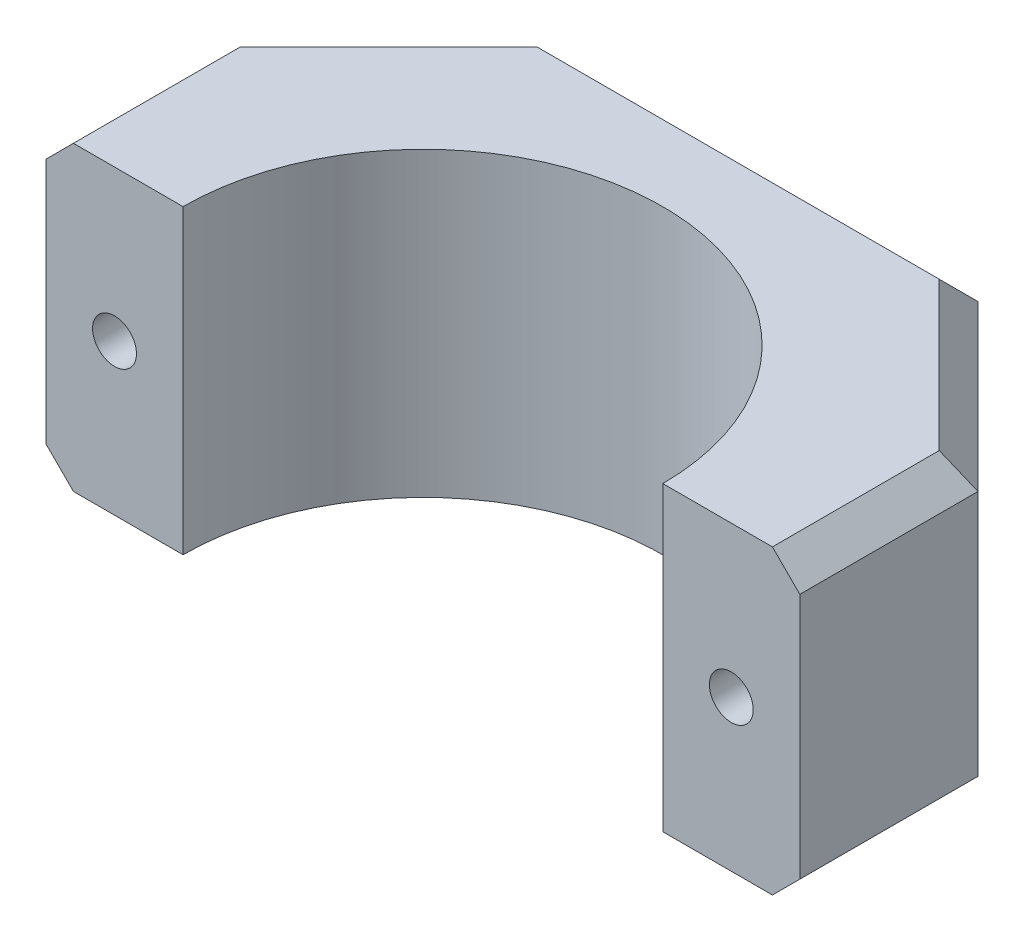
ISO-10303-21;
HEADER;
FILE_DESCRIPTION(('STEP AP214'),'2;1');
FILE_NAME('part.step','',(''),(''),'','','');
FILE_SCHEMA(('AUTOMOTIVE_DESIGN { 1 0 10303 214 1 1 1 1 }'));
ENDSEC;
DATA;
#1=APPLICATION_CONTEXT('core data for automotive mechanical design processes');
#2=APPLICATION_PROTOCOL_DEFINITION('international standard','automotive_design',2000,#1);
#3=PRODUCT_CONTEXT('',#1,'mechanical');
#4=PRODUCT('Part','Part','',(#3));
#5=PRODUCT_RELATED_PRODUCT_CATEGORY('part','',(#4));
#6=PRODUCT_DEFINITION_FORMATION('','',#4);
#7=PRODUCT_DEFINITION_CONTEXT('part definition',#1,'design');
#8=PRODUCT_DEFINITION('design','',#6,#7);
#9=PRODUCT_DEFINITION_SHAPE('','',#8);
#10=(LENGTH_UNIT() NAMED_UNIT(*) SI_UNIT(.MILLI.,.METRE.));
#11=(NAMED_UNIT(*) PLANE_ANGLE_UNIT() SI_UNIT($,.RADIAN.));
#12=(NAMED_UNIT(*) SI_UNIT($,.STERADIAN.) SOLID_ANGLE_UNIT());
#13=UNCERTAINTY_MEASURE_WITH_UNIT(LENGTH_MEASURE(1.E-05),#10,'distance_accuracy_value','');
#14=(GEOMETRIC_REPRESENTATION_CONTEXT(3) GLOBAL_UNCERTAINTY_ASSIGNED_CONTEXT((#13)) GLOBAL_UNIT_ASSIGNED_CONTEXT((#10,
#11,#12)) REPRESENTATION_CONTEXT('',''));
#15=CARTESIAN_POINT('',(0.,0.,0.));
#16=DIRECTION('',(0.,0.,1.));
#17=DIRECTION('',(1.,0.,0.));
#18=AXIS2_PLACEMENT_3D('',#15,#16,#17);
#19=CARTESIAN_POINT('',(-43.985549132948,11.,6.55438513369794));
#20=DIRECTION('',(0.,0.,-1.));
#21=DIRECTION('',(-1.,0.,0.));
#22=AXIS2_PLACEMENT_3D('',#19,#20,#21);
#23=CYLINDRICAL_SURFACE('',#22,1.6);
#24=CARTESIAN_POINT('',(-43.985549132948,11.,2.02890173410404));
#25=DIRECTION('',(0.,0.,-1.));
#26=DIRECTION('',(-1.,0.,0.));
#27=AXIS2_PLACEMENT_3D('',#24,#25,#26);
#28=CIRCLE('',#27,1.6);
#29=CARTESIAN_POINT('',(-45.585549132948,11.,2.02890173410404));
#30=VERTEX_POINT('',#29);
#31=EDGE_CURVE('E277',#30,#30,#28,.F.);
#32=ORIENTED_EDGE('',*,*,#31,.T.);
#33=EDGE_LOOP('',(#32));
#34=FACE_BOUND('',#33,.T.);
#35=CARTESIAN_POINT('',(-43.985549132948,11.,-1.97109826589596));
#36=DIRECTION('',(0.,0.,-1.));
#37=DIRECTION('',(-1.,0.,0.));
#38=AXIS2_PLACEMENT_3D('',#35,#36,#37);
#39=CIRCLE('',#38,1.6);
#40=CARTESIAN_POINT('',(-45.585549132948,11.,-1.97109826589596));
#41=VERTEX_POINT('',#40);
#42=EDGE_CURVE('E194',#41,#41,#39,.F.);
#43=ORIENTED_EDGE('',*,*,#42,.F.);
#44=EDGE_LOOP('',(#43));
#45=FACE_BOUND('',#44,.T.);
#46=ADVANCED_FACE('F39',(#34,#45),#23,.F.);
#47=CARTESIAN_POINT('',(1.01445086705203,11.,6.55438513369794));
#48=DIRECTION('',(0.,0.,-1.));
#49=DIRECTION('',(-1.,0.,0.));
#50=AXIS2_PLACEMENT_3D('',#47,#48,#49);
#51=CYLINDRICAL_SURFACE('',#50,1.6);
#52=CARTESIAN_POINT('',(1.01445086705203,11.,2.02890173410404));
#53=DIRECTION('',(0.,0.,-1.));
#54=DIRECTION('',(-1.,0.,0.));
#55=AXIS2_PLACEMENT_3D('',#52,#53,#54);
#56=CIRCLE('',#55,1.6);
#57=CARTESIAN_POINT('',(-0.585549132947969,11.,2.02890173410404));
#58=VERTEX_POINT('',#57);
#59=EDGE_CURVE('E188',#58,#58,#56,.F.);
#60=ORIENTED_EDGE('',*,*,#59,.T.);
#61=EDGE_LOOP('',(#60));
#62=FACE_BOUND('',#61,.T.);
#63=CARTESIAN_POINT('',(1.01445086705203,11.,-1.97109826589596));
#64=DIRECTION('',(0.,0.,-1.));
#65=DIRECTION('',(-1.,0.,0.));
#66=AXIS2_PLACEMENT_3D('',#63,#64,#65);
#67=CIRCLE('',#66,1.6);
#68=CARTESIAN_POINT('',(-0.585549132947969,11.,-1.97109826589596));
#69=VERTEX_POINT('',#68);
#70=EDGE_CURVE('E189',#69,#69,#67,.F.);
#71=ORIENTED_EDGE('',*,*,#70,.F.);
#72=EDGE_LOOP('',(#71));
#73=FACE_BOUND('',#72,.T.);
#74=ADVANCED_FACE('F344',(#62,#73),#51,.F.);
#75=CARTESIAN_POINT('',(-21.485549132948,22.,2.02890173410404));
#76=DIRECTION('',(0.,-1.,0.));
#77=DIRECTION('',(0.,0.,-1.));
#78=AXIS2_PLACEMENT_3D('',#75,#76,#77);
#79=CYLINDRICAL_SURFACE('',#78,17.5);
#80=CARTESIAN_POINT('',(-21.485549132948,0.,2.02890173410404));
#81=DIRECTION('',(0.,-1.,0.));
#82=DIRECTION('',(0.,0.,-1.));
#83=AXIS2_PLACEMENT_3D('',#80,#81,#82);
#84=CIRCLE('',#83,17.5);
#85=CARTESIAN_POINT('',(-38.985549132948,0.,2.02890173410404));
#86=VERTEX_POINT('',#85);
#87=CARTESIAN_POINT('',(-3.98554913294797,0.,2.02890173410404));
#88=VERTEX_POINT('',#87);
#89=EDGE_CURVE('E164',#86,#88,#84,.T.);
#90=ORIENTED_EDGE('',*,*,#89,.T.);
#91=DIRECTION('',(0.,-1.,0.));
#92=VECTOR('',#91,1.);
#93=CARTESIAN_POINT('',(-3.98554913294797,22.,2.02890173410404));
#94=LINE('',#93,#92);
#95=CARTESIAN_POINT('',(-3.98554913294797,22.,2.02890173410404));
#96=VERTEX_POINT('',#95);
#97=EDGE_CURVE('E145',#96,#88,#94,.T.);
#98=ORIENTED_EDGE('',*,*,#97,.F.);
#99=CARTESIAN_POINT('',(-21.485549132948,22.,2.02890173410404));
#100=DIRECTION('',(0.,-1.,0.));
#101=DIRECTION('',(0.,0.,-1.));
#102=AXIS2_PLACEMENT_3D('',#99,#100,#101);
#103=CIRCLE('',#102,17.5);
#104=CARTESIAN_POINT('',(-38.985549132948,22.,2.02890173410404));
#105=VERTEX_POINT('',#104);
#106=EDGE_CURVE('E152',#105,#96,#103,.T.);
#107=ORIENTED_EDGE('',*,*,#106,.F.);
#108=DIRECTION('',(0.,-1.,0.));
#109=VECTOR('',#108,1.);
#110=CARTESIAN_POINT('',(-38.985549132948,22.,2.02890173410404));
#111=LINE('',#110,#109);
#112=EDGE_CURVE('E271',#105,#86,#111,.T.);
#113=ORIENTED_EDGE('',*,*,#112,.T.);
#114=EDGE_LOOP('',(#90,#98,#107,#113));
#115=FACE_BOUND('',#114,.T.);
#116=ADVANCED_FACE('F162',(#115),#79,.F.);
#117=CARTESIAN_POINT('',(6.01445086705203,22.,2.02890173410404));
#118=DIRECTION('',(0.,0.,-1.));
#119=DIRECTION('',(-1.,0.,0.));
#120=AXIS2_PLACEMENT_3D('',#117,#118,#119);
#121=PLANE('',#120);
#122=ORIENTED_EDGE('',*,*,#59,.F.);
#123=EDGE_LOOP('',(#122));
#124=FACE_BOUND('',#123,.T.);
#125=DIRECTION('',(1.,0.,0.));
#126=VECTOR('',#125,1.);
#127=CARTESIAN_POINT('',(6.01445086705203,0.,2.02890173410404));
#128=LINE('',#127,#126);
#129=CARTESIAN_POINT('',(4.01445086705201,0.,2.02890173410404));
#130=VERTEX_POINT('',#129);
#131=EDGE_CURVE('E276',#88,#130,#128,.T.);
#132=ORIENTED_EDGE('',*,*,#131,.T.);
#133=DIRECTION('',(0.707106781186548,0.707106781186548,0.));
#134=VECTOR('',#133,1.);
#135=CARTESIAN_POINT('',(6.01445086705203,2.00000000000002,2.02890173410404));
#136=LINE('',#135,#134);
#137=CARTESIAN_POINT('',(6.01445086705203,2.00000000000002,2.02890173410404));
#138=VERTEX_POINT('',#137);
#139=EDGE_CURVE('E222',#130,#138,#136,.T.);
#140=ORIENTED_EDGE('',*,*,#139,.T.);
#141=DIRECTION('',(0.,-1.,0.));
#142=VECTOR('',#141,1.);
#143=CARTESIAN_POINT('',(6.01445086705203,22.,2.02890173410404));
#144=LINE('',#143,#142);
#145=CARTESIAN_POINT('',(6.01445086705203,20.,2.02890173410404));
#146=VERTEX_POINT('',#145);
#147=EDGE_CURVE('E166',#146,#138,#144,.T.);
#148=ORIENTED_EDGE('',*,*,#147,.F.);
#149=DIRECTION('',(0.707106781186547,-0.707106781186548,0.));
#150=VECTOR('',#149,1.);
#151=CARTESIAN_POINT('',(4.01445086705202,22.,2.02890173410404));
#152=LINE('',#151,#150);
#153=CARTESIAN_POINT('',(4.01445086705202,22.,2.02890173410404));
#154=VERTEX_POINT('',#153);
#155=EDGE_CURVE('E149',#146,#154,#152,.F.);
#156=ORIENTED_EDGE('',*,*,#155,.T.);
#157=DIRECTION('',(1.,0.,0.));
#158=VECTOR('',#157,1.);
#159=CARTESIAN_POINT('',(6.01445086705203,22.,2.02890173410404));
#160=LINE('',#159,#158);
#161=EDGE_CURVE('E140',#96,#154,#160,.T.);
#162=ORIENTED_EDGE('',*,*,#161,.F.);
#163=ORIENTED_EDGE('',*,*,#97,.T.);
#164=EDGE_LOOP('',(#132,#140,#148,#156,#162,#163));
#165=FACE_BOUND('',#164,.T.);
#166=ADVANCED_FACE('F143',(#124,#165),#121,.F.);
#167=CARTESIAN_POINT('',(6.01445086705203,22.,-22.971098265896));
#168=DIRECTION('',(-1.,0.,0.));
#169=DIRECTION('',(0.,0.,1.));
#170=AXIS2_PLACEMENT_3D('',#167,#168,#169);
#171=PLANE('',#170);
#172=ORIENTED_EDGE('',*,*,#147,.T.);
#173=DIRECTION('',(0.,0.,-1.));
#174=VECTOR('',#173,1.);
#175=CARTESIAN_POINT('',(6.01445086705203,2.00000000000002,-10.9710982658959));
#176=LINE('',#175,#174);
#177=CARTESIAN_POINT('',(6.01445086705203,2.00000000000002,-10.9710982658959));
#178=VERTEX_POINT('',#177);
#179=EDGE_CURVE('E219',#138,#178,#176,.T.);
#180=ORIENTED_EDGE('',*,*,#179,.T.);
#181=DIRECTION('',(0.,1.,0.));
#182=VECTOR('',#181,1.);
#183=CARTESIAN_POINT('',(6.01445086705203,22.,-10.9710982658959));
#184=LINE('',#183,#182);
#185=CARTESIAN_POINT('',(6.01445086705203,20.,-10.9710982658959));
#186=VERTEX_POINT('',#185);
#187=EDGE_CURVE('E178',#178,#186,#184,.T.);
#188=ORIENTED_EDGE('',*,*,#187,.T.);
#189=DIRECTION('',(0.,0.,1.));
#190=VECTOR('',#189,1.);
#191=CARTESIAN_POINT('',(6.01445086705203,20.,-22.971098265896));
#192=LINE('',#191,#190);
#193=EDGE_CURVE('E217',#186,#146,#192,.T.);
#194=ORIENTED_EDGE('',*,*,#193,.T.);
#195=EDGE_LOOP('',(#172,#180,#188,#194));
#196=FACE_BOUND('',#195,.T.);
#197=ADVANCED_FACE('F311',(#196),#171,.F.);
#198=CARTESIAN_POINT('',(-48.985549132948,22.,-22.971098265896));
#199=DIRECTION('',(0.,0.,1.));
#200=DIRECTION('',(1.,0.,0.));
#201=AXIS2_PLACEMENT_3D('',#198,#199,#200);
#202=PLANE('',#201);
#203=DIRECTION('',(0.,-1.,0.));
#204=VECTOR('',#203,1.);
#205=CARTESIAN_POINT('',(-5.985549132948,22.,-22.971098265896));
#206=LINE('',#205,#204);
#207=CARTESIAN_POINT('',(-5.985549132948,20.,-22.971098265896));
#208=VERTEX_POINT('',#207);
#209=CARTESIAN_POINT('',(-5.985549132948,2.00000000000002,-22.971098265896));
#210=VERTEX_POINT('',#209);
#211=EDGE_CURVE('E169',#208,#210,#206,.T.);
#212=ORIENTED_EDGE('',*,*,#211,.T.);
#213=DIRECTION('',(-1.,0.,0.));
#214=VECTOR('',#213,1.);
#215=CARTESIAN_POINT('',(-36.9855491329479,2.00000000000002,-22.971098265896));
#216=LINE('',#215,#214);
#217=CARTESIAN_POINT('',(-36.9855491329479,2.00000000000002,-22.971098265896));
#218=VERTEX_POINT('',#217);
#219=EDGE_CURVE('E226',#210,#218,#216,.T.);
#220=ORIENTED_EDGE('',*,*,#219,.T.);
#221=DIRECTION('',(0.,1.,0.));
#222=VECTOR('',#221,1.);
#223=CARTESIAN_POINT('',(-36.9855491329479,22.,-22.971098265896));
#224=LINE('',#223,#222);
#225=CARTESIAN_POINT('',(-36.9855491329479,20.,-22.971098265896));
#226=VERTEX_POINT('',#225);
#227=EDGE_CURVE('E165',#218,#226,#224,.T.);
#228=ORIENTED_EDGE('',*,*,#227,.T.);
#229=DIRECTION('',(1.,0.,0.));
#230=VECTOR('',#229,1.);
#231=CARTESIAN_POINT('',(-48.985549132948,20.,-22.971098265896));
#232=LINE('',#231,#230);
#233=EDGE_CURVE('E224',#226,#208,#232,.T.);
#234=ORIENTED_EDGE('',*,*,#233,.T.);
#235=EDGE_LOOP('',(#212,#220,#228,#234));
#236=FACE_BOUND('',#235,.T.);
#237=ADVANCED_FACE('F325',(#236),#202,.F.);
#238=CARTESIAN_POINT('',(-48.985549132948,22.,2.02890173410404));
#239=DIRECTION('',(1.,0.,0.));
#240=DIRECTION('',(0.,0.,-1.));
#241=AXIS2_PLACEMENT_3D('',#238,#239,#240);
#242=PLANE('',#241);
#243=DIRECTION('',(0.,-1.,0.));
#244=VECTOR('',#243,1.);
#245=CARTESIAN_POINT('',(-48.985549132948,22.,-10.9710982658959));
#246=LINE('',#245,#244);
#247=CARTESIAN_POINT('',(-48.985549132948,20.,-10.9710982658959));
#248=VERTEX_POINT('',#247);
#249=CARTESIAN_POINT('',(-48.985549132948,2.00000000000002,-10.9710982658959));
#250=VERTEX_POINT('',#249);
#251=EDGE_CURVE('E181',#248,#250,#246,.T.);
#252=ORIENTED_EDGE('',*,*,#251,.T.);
#253=DIRECTION('',(0.,0.,1.));
#254=VECTOR('',#253,1.);
#255=CARTESIAN_POINT('',(-48.985549132948,2.00000000000002,2.02890173410404));
#256=LINE('',#255,#254);
#257=CARTESIAN_POINT('',(-48.985549132948,2.00000000000002,2.02890173410404));
#258=VERTEX_POINT('',#257);
#259=EDGE_CURVE('E196',#250,#258,#256,.T.);
#260=ORIENTED_EDGE('',*,*,#259,.T.);
#261=DIRECTION('',(0.,-1.,0.));
#262=VECTOR('',#261,1.);
#263=CARTESIAN_POINT('',(-48.985549132948,22.,2.02890173410404));
#264=LINE('',#263,#262);
#265=CARTESIAN_POINT('',(-48.985549132948,20.,2.02890173410404));
#266=VERTEX_POINT('',#265);
#267=EDGE_CURVE('E172',#266,#258,#264,.T.);
#268=ORIENTED_EDGE('',*,*,#267,.F.);
#269=DIRECTION('',(0.,0.,-1.));
#270=VECTOR('',#269,1.);
#271=CARTESIAN_POINT('',(-48.985549132948,20.,2.02890173410404));
#272=LINE('',#271,#270);
#273=EDGE_CURVE('E184',#266,#248,#272,.T.);
#274=ORIENTED_EDGE('',*,*,#273,.T.);
#275=EDGE_LOOP('',(#252,#260,#268,#274));
#276=FACE_BOUND('',#275,.T.);
#277=ADVANCED_FACE('F281',(#276),#242,.F.);
#278=CARTESIAN_POINT('',(-38.985549132948,22.,2.02890173410404));
#279=DIRECTION('',(0.,0.,-1.));
#280=DIRECTION('',(-1.,0.,0.));
#281=AXIS2_PLACEMENT_3D('',#278,#279,#280);
#282=PLANE('',#281);
#283=ORIENTED_EDGE('',*,*,#31,.F.);
#284=EDGE_LOOP('',(#283));
#285=FACE_BOUND('',#284,.T.);
#286=ORIENTED_EDGE('',*,*,#267,.T.);
#287=DIRECTION('',(0.707106781186548,-0.707106781186548,0.));
#288=VECTOR('',#287,1.);
#289=CARTESIAN_POINT('',(-48.985549132948,2.00000000000002,2.02890173410404));
#290=LINE('',#289,#288);
#291=CARTESIAN_POINT('',(-46.985549132948,0.,2.02890173410404));
#292=VERTEX_POINT('',#291);
#293=EDGE_CURVE('E201',#258,#292,#290,.T.);
#294=ORIENTED_EDGE('',*,*,#293,.T.);
#295=DIRECTION('',(1.,0.,0.));
#296=VECTOR('',#295,1.);
#297=CARTESIAN_POINT('',(-38.985549132948,0.,2.02890173410404));
#298=LINE('',#297,#296);
#299=EDGE_CURVE('E160',#292,#86,#298,.T.);
#300=ORIENTED_EDGE('',*,*,#299,.T.);
#301=ORIENTED_EDGE('',*,*,#112,.F.);
#302=DIRECTION('',(1.,0.,0.));
#303=VECTOR('',#302,1.);
#304=CARTESIAN_POINT('',(-38.985549132948,22.,2.02890173410404));
#305=LINE('',#304,#303);
#306=CARTESIAN_POINT('',(-46.985549132948,22.,2.02890173410404));
#307=VERTEX_POINT('',#306);
#308=EDGE_CURVE('E151',#307,#105,#305,.T.);
#309=ORIENTED_EDGE('',*,*,#308,.F.);
#310=DIRECTION('',(0.707106781186548,0.707106781186548,0.));
#311=VECTOR('',#310,1.);
#312=CARTESIAN_POINT('',(-46.985549132948,22.,2.02890173410404));
#313=LINE('',#312,#311);
#314=EDGE_CURVE('E199',#307,#266,#313,.F.);
#315=ORIENTED_EDGE('',*,*,#314,.T.);
#316=EDGE_LOOP('',(#286,#294,#300,#301,#309,#315));
#317=FACE_BOUND('',#316,.T.);
#318=ADVANCED_FACE('F269',(#285,#317),#282,.F.);
#319=CARTESIAN_POINT('',(-21.485549132948,22.,2.02890173410404));
#320=DIRECTION('',(0.,-1.,0.));
#321=DIRECTION('',(0.,0.,-1.));
#322=AXIS2_PLACEMENT_3D('',#319,#320,#321);
#323=PLANE('',#322);
#324=ORIENTED_EDGE('',*,*,#161,.T.);
#325=DIRECTION('',(0.,0.,-1.));
#326=VECTOR('',#325,1.);
#327=CARTESIAN_POINT('',(4.01445086705202,22.,2.02890173410404));
#328=LINE('',#327,#326);
#329=CARTESIAN_POINT('',(4.01445086705202,22.,-10.1426711411497));
#330=VERTEX_POINT('',#329);
#331=EDGE_CURVE('E13',#154,#330,#328,.T.);
#332=ORIENTED_EDGE('',*,*,#331,.T.);
#333=DIRECTION('',(-0.707106781186548,0.,-0.707106781186548));
#334=VECTOR('',#333,1.);
#335=CARTESIAN_POINT('',(-7.39976269532111,22.,-21.5568847035229));
#336=LINE('',#335,#334);
#337=CARTESIAN_POINT('',(-6.8139762576942,22.,-20.9710982658959));
#338=VERTEX_POINT('',#337);
#339=EDGE_CURVE('E232',#330,#338,#336,.T.);
#340=ORIENTED_EDGE('',*,*,#339,.T.);
#341=DIRECTION('',(-1.,0.,0.));
#342=VECTOR('',#341,1.);
#343=CARTESIAN_POINT('',(-21.485549132948,22.,-20.9710982658959));
#344=LINE('',#343,#342);
#345=CARTESIAN_POINT('',(-36.1571220082017,22.,-20.9710982658959));
#346=VERTEX_POINT('',#345);
#347=EDGE_CURVE('E61',#338,#346,#344,.T.);
#348=ORIENTED_EDGE('',*,*,#347,.T.);
#349=DIRECTION('',(-0.707106781186547,0.,0.707106781186548));
#350=VECTOR('',#349,1.);
#351=CARTESIAN_POINT('',(-47.5713355705749,22.,-9.55688470352281));
#352=LINE('',#351,#350);
#353=CARTESIAN_POINT('',(-46.985549132948,22.,-10.1426711411497));
#354=VERTEX_POINT('',#353);
#355=EDGE_CURVE('E56',#346,#354,#352,.T.);
#356=ORIENTED_EDGE('',*,*,#355,.T.);
#357=DIRECTION('',(0.,0.,1.));
#358=VECTOR('',#357,1.);
#359=CARTESIAN_POINT('',(-46.985549132948,22.,2.02890173410404));
#360=LINE('',#359,#358);
#361=EDGE_CURVE('E48',#354,#307,#360,.T.);
#362=ORIENTED_EDGE('',*,*,#361,.T.);
#363=ORIENTED_EDGE('',*,*,#308,.T.);
#364=ORIENTED_EDGE('',*,*,#106,.T.);
#365=EDGE_LOOP('',(#324,#332,#340,#348,#356,#362,#363,#364));
#366=FACE_BOUND('',#365,.T.);
#367=ADVANCED_FACE('F155',(#366),#323,.F.);
#368=CARTESIAN_POINT('',(-21.485549132948,0.,2.02890173410404));
#369=DIRECTION('',(0.,-1.,0.));
#370=DIRECTION('',(0.,0.,-1.));
#371=AXIS2_PLACEMENT_3D('',#368,#369,#370);
#372=PLANE('',#371);
#373=ORIENTED_EDGE('',*,*,#299,.F.);
#374=DIRECTION('',(0.,0.,-1.));
#375=VECTOR('',#374,1.);
#376=CARTESIAN_POINT('',(-46.985549132948,0.,-10.9710982658959));
#377=LINE('',#376,#375);
#378=CARTESIAN_POINT('',(-46.985549132948,0.,-10.1426711411497));
#379=VERTEX_POINT('',#378);
#380=EDGE_CURVE('E211',#292,#379,#377,.T.);
#381=ORIENTED_EDGE('',*,*,#380,.T.);
#382=DIRECTION('',(0.707106781186547,0.,-0.707106781186548));
#383=VECTOR('',#382,1.);
#384=CARTESIAN_POINT('',(-40.3213355705749,0.,-16.8068847035228));
#385=LINE('',#384,#383);
#386=CARTESIAN_POINT('',(-36.1571220082017,0.,-20.9710982658959));
#387=VERTEX_POINT('',#386);
#388=EDGE_CURVE('E209',#379,#387,#385,.T.);
#389=ORIENTED_EDGE('',*,*,#388,.T.);
#390=DIRECTION('',(1.,0.,0.));
#391=VECTOR('',#390,1.);
#392=CARTESIAN_POINT('',(-5.985549132948,0.,-20.9710982658959));
#393=LINE('',#392,#391);
#394=CARTESIAN_POINT('',(-6.8139762576942,0.,-20.9710982658959));
#395=VERTEX_POINT('',#394);
#396=EDGE_CURVE('E205',#387,#395,#393,.T.);
#397=ORIENTED_EDGE('',*,*,#396,.T.);
#398=DIRECTION('',(0.707106781186548,0.,0.707106781186548));
#399=VECTOR('',#398,1.);
#400=CARTESIAN_POINT('',(-2.6497626953211,0.,-16.8068847035228));
#401=LINE('',#400,#399);
#402=CARTESIAN_POINT('',(4.01445086705201,0.,-10.1426711411497));
#403=VERTEX_POINT('',#402);
#404=EDGE_CURVE('E203',#395,#403,#401,.T.);
#405=ORIENTED_EDGE('',*,*,#404,.T.);
#406=DIRECTION('',(0.,0.,1.));
#407=VECTOR('',#406,1.);
#408=CARTESIAN_POINT('',(4.01445086705201,0.,2.02890173410404));
#409=LINE('',#408,#407);
#410=EDGE_CURVE('E207',#403,#130,#409,.T.);
#411=ORIENTED_EDGE('',*,*,#410,.T.);
#412=ORIENTED_EDGE('',*,*,#131,.F.);
#413=ORIENTED_EDGE('',*,*,#89,.F.);
#414=EDGE_LOOP('',(#373,#381,#389,#397,#405,#411,#412,#413));
#415=FACE_BOUND('',#414,.T.);
#416=ADVANCED_FACE('F290',(#415),#372,.T.);
#417=CARTESIAN_POINT('',(-5.985549132948,22.,-22.971098265896));
#418=DIRECTION('',(-0.707106781186548,0.,0.707106781186548));
#419=DIRECTION('',(0.,-1.,0.));
#420=AXIS2_PLACEMENT_3D('',#417,#418,#419);
#421=PLANE('',#420);
#422=CARTESIAN_POINT('',(1.01445086705203,11.,-15.9710982658959));
#423=DIRECTION('',(-0.707106781186548,0.,0.707106781186548));
#424=DIRECTION('',(-0.707106781186548,0.,-0.707106781186548));
#425=AXIS2_PLACEMENT_3D('',#422,#423,#424);
#426=ELLIPSE('',#425,4.24264068711929,3.);
#427=CARTESIAN_POINT('',(-1.98554913294797,11.,-18.9710982658959));
#428=VERTEX_POINT('',#427);
#429=EDGE_CURVE('E185',#428,#428,#426,.F.);
#430=ORIENTED_EDGE('',*,*,#429,.F.);
#431=EDGE_LOOP('',(#430));
#432=FACE_BOUND('',#431,.T.);
#433=ORIENTED_EDGE('',*,*,#187,.F.);
#434=DIRECTION('',(0.707106781186548,0.,0.707106781186548));
#435=VECTOR('',#434,1.);
#436=CARTESIAN_POINT('',(-5.985549132948,2.00000000000002,-22.971098265896));
#437=LINE('',#436,#435);
#438=EDGE_CURVE('E230',#178,#210,#437,.F.);
#439=ORIENTED_EDGE('',*,*,#438,.T.);
#440=ORIENTED_EDGE('',*,*,#211,.F.);
#441=DIRECTION('',(-0.707106781186548,0.,-0.707106781186548));
#442=VECTOR('',#441,1.);
#443=CARTESIAN_POINT('',(6.01445086705203,20.,-10.9710982658959));
#444=LINE('',#443,#442);
#445=EDGE_CURVE('E228',#208,#186,#444,.F.);
#446=ORIENTED_EDGE('',*,*,#445,.T.);
#447=EDGE_LOOP('',(#433,#439,#440,#446));
#448=FACE_BOUND('',#447,.T.);
#449=ADVANCED_FACE('F328',(#432,#448),#421,.F.);
#450=CARTESIAN_POINT('',(-48.985549132948,22.,-10.9710982658959));
#451=DIRECTION('',(0.707106781186548,0.,0.707106781186547));
#452=DIRECTION('',(0.,-1.,0.));
#453=AXIS2_PLACEMENT_3D('',#450,#451,#452);
#454=PLANE('',#453);
#455=CARTESIAN_POINT('',(-43.985549132948,11.,-15.9710982658959));
#456=DIRECTION('',(0.707106781186548,0.,0.707106781186547));
#457=DIRECTION('',(0.707106781186547,0.,-0.707106781186548));
#458=AXIS2_PLACEMENT_3D('',#455,#456,#457);
#459=ELLIPSE('',#458,4.24264068711929,3.);
#460=CARTESIAN_POINT('',(-40.985549132948,11.,-18.9710982658959));
#461=VERTEX_POINT('',#460);
#462=EDGE_CURVE('E190',#461,#461,#459,.F.);
#463=ORIENTED_EDGE('',*,*,#462,.F.);
#464=EDGE_LOOP('',(#463));
#465=FACE_BOUND('',#464,.T.);
#466=ORIENTED_EDGE('',*,*,#227,.F.);
#467=DIRECTION('',(0.707106781186547,0.,-0.707106781186548));
#468=VECTOR('',#467,1.);
#469=CARTESIAN_POINT('',(-48.985549132948,2.00000000000002,-10.9710982658959));
#470=LINE('',#469,#468);
#471=EDGE_CURVE('E215',#218,#250,#470,.F.);
#472=ORIENTED_EDGE('',*,*,#471,.T.);
#473=ORIENTED_EDGE('',*,*,#251,.F.);
#474=DIRECTION('',(-0.707106781186547,0.,0.707106781186548));
#475=VECTOR('',#474,1.);
#476=CARTESIAN_POINT('',(-36.9855491329479,20.,-22.971098265896));
#477=LINE('',#476,#475);
#478=EDGE_CURVE('E213',#248,#226,#477,.F.);
#479=ORIENTED_EDGE('',*,*,#478,.T.);
#480=EDGE_LOOP('',(#466,#472,#473,#479));
#481=FACE_BOUND('',#480,.T.);
#482=ADVANCED_FACE('F330',(#465,#481),#454,.F.);
#483=CARTESIAN_POINT('',(1.01445086705203,11.,10.5141831083426));
#484=DIRECTION('',(0.,0.,-1.));
#485=DIRECTION('',(-1.,0.,0.));
#486=AXIS2_PLACEMENT_3D('',#483,#484,#485);
#487=CYLINDRICAL_SURFACE('',#486,3.);
#488=ORIENTED_EDGE('',*,*,#429,.T.);
#489=EDGE_LOOP('',(#488));
#490=FACE_BOUND('',#489,.T.);
#491=CARTESIAN_POINT('',(1.01445086705203,11.,-1.97109826589596));
#492=DIRECTION('',(0.,0.,-1.));
#493=DIRECTION('',(-1.,0.,0.));
#494=AXIS2_PLACEMENT_3D('',#491,#492,#493);
#495=CIRCLE('',#494,3.);
#496=CARTESIAN_POINT('',(-1.98554913294797,11.,-1.97109826589596));
#497=VERTEX_POINT('',#496);
#498=EDGE_CURVE('E193',#497,#497,#495,.F.);
#499=ORIENTED_EDGE('',*,*,#498,.T.);
#500=EDGE_LOOP('',(#499));
#501=FACE_BOUND('',#500,.T.);
#502=ADVANCED_FACE('F337',(#490,#501),#487,.F.);
#503=CARTESIAN_POINT('',(-38.985549132948,22.,-1.97109826589596));
#504=DIRECTION('',(0.,0.,-1.));
#505=DIRECTION('',(-1.,0.,0.));
#506=AXIS2_PLACEMENT_3D('',#503,#504,#505);
#507=PLANE('',#506);
#508=ORIENTED_EDGE('',*,*,#498,.F.);
#509=EDGE_LOOP('',(#508));
#510=FACE_BOUND('',#509,.T.);
#511=ORIENTED_EDGE('',*,*,#70,.T.);
#512=EDGE_LOOP('',(#511));
#513=FACE_BOUND('',#512,.T.);
#514=ADVANCED_FACE('F509',(#510,#513),#507,.T.);
#515=CARTESIAN_POINT('',(-43.985549132948,11.,10.5141831083426));
#516=DIRECTION('',(0.,0.,-1.));
#517=DIRECTION('',(-1.,0.,0.));
#518=AXIS2_PLACEMENT_3D('',#515,#516,#517);
#519=CYLINDRICAL_SURFACE('',#518,3.);
#520=ORIENTED_EDGE('',*,*,#462,.T.);
#521=EDGE_LOOP('',(#520));
#522=FACE_BOUND('',#521,.T.);
#523=CARTESIAN_POINT('',(-43.985549132948,11.,-1.97109826589596));
#524=DIRECTION('',(0.,0.,-1.));
#525=DIRECTION('',(-1.,0.,0.));
#526=AXIS2_PLACEMENT_3D('',#523,#524,#525);
#527=CIRCLE('',#526,3.);
#528=CARTESIAN_POINT('',(-46.985549132948,11.,-1.97109826589596));
#529=VERTEX_POINT('',#528);
#530=EDGE_CURVE('E249',#529,#529,#527,.F.);
#531=ORIENTED_EDGE('',*,*,#530,.T.);
#532=EDGE_LOOP('',(#531));
#533=FACE_BOUND('',#532,.T.);
#534=ADVANCED_FACE('F502',(#522,#533),#519,.F.);
#535=CARTESIAN_POINT('',(-38.985549132948,22.,-1.97109826589596));
#536=DIRECTION('',(0.,0.,-1.));
#537=DIRECTION('',(-1.,0.,0.));
#538=AXIS2_PLACEMENT_3D('',#535,#536,#537);
#539=PLANE('',#538);
#540=ORIENTED_EDGE('',*,*,#530,.F.);
#541=EDGE_LOOP('',(#540));
#542=FACE_BOUND('',#541,.T.);
#543=ORIENTED_EDGE('',*,*,#42,.T.);
#544=EDGE_LOOP('',(#543));
#545=FACE_BOUND('',#544,.T.);
#546=ADVANCED_FACE('F424',(#542,#545),#539,.T.);
#547=CARTESIAN_POINT('',(6.01445086705203,2.00000000000002,-22.971098265896));
#548=DIRECTION('',(0.707106781186547,-0.707106781186547,0.));
#549=DIRECTION('',(0.,0.,1.));
#550=AXIS2_PLACEMENT_3D('',#547,#548,#549);
#551=PLANE('',#550);
#552=ORIENTED_EDGE('',*,*,#139,.F.);
#553=ORIENTED_EDGE('',*,*,#410,.F.);
#554=DIRECTION('',(-0.678598344545847,-0.678598344545847,0.281084637714821));
#555=VECTOR('',#554,1.);
#556=CARTESIAN_POINT('',(2.21676497459438,-1.79768589245763,-9.39804526360699));
#557=LINE('',#556,#555);
#558=EDGE_CURVE('E246',#178,#403,#557,.T.);
#559=ORIENTED_EDGE('',*,*,#558,.F.);
#560=ORIENTED_EDGE('',*,*,#179,.F.);
#561=EDGE_LOOP('',(#552,#553,#559,#560));
#562=FACE_BOUND('',#561,.T.);
#563=ADVANCED_FACE('F309',(#562),#551,.T.);
#564=CARTESIAN_POINT('',(-2.6497626953211,0.,-16.8068847035228));
#565=DIRECTION('',(0.5,-0.707106781186548,-0.5));
#566=DIRECTION('',(-0.707106781186548,0.,-0.707106781186548));
#567=AXIS2_PLACEMENT_3D('',#564,#565,#566);
#568=PLANE('',#567);
#569=ORIENTED_EDGE('',*,*,#558,.T.);
#570=ORIENTED_EDGE('',*,*,#404,.F.);
#571=DIRECTION('',(0.281084637714821,0.678598344545847,-0.678598344545847));
#572=VECTOR('',#571,1.);
#573=CARTESIAN_POINT('',(-7.27926464455875,-1.12330553398309,-19.8477927319128));
#574=LINE('',#573,#572);
#575=EDGE_CURVE('E243',#210,#395,#574,.F.);
#576=ORIENTED_EDGE('',*,*,#575,.F.);
#577=ORIENTED_EDGE('',*,*,#438,.F.);
#578=EDGE_LOOP('',(#569,#570,#576,#577));
#579=FACE_BOUND('',#578,.T.);
#580=ADVANCED_FACE('F303',(#579),#568,.T.);
#581=CARTESIAN_POINT('',(-48.985549132948,2.00000000000002,-22.971098265896));
#582=DIRECTION('',(0.,-0.707106781186547,-0.707106781186547));
#583=DIRECTION('',(1.,0.,0.));
#584=AXIS2_PLACEMENT_3D('',#581,#582,#583);
#585=PLANE('',#584);
#586=ORIENTED_EDGE('',*,*,#575,.T.);
#587=ORIENTED_EDGE('',*,*,#396,.F.);
#588=DIRECTION('',(-0.28108463771482,0.678598344545847,-0.678598344545847));
#589=VECTOR('',#588,1.);
#590=CARTESIAN_POINT('',(-37.9336520156592,4.28892283796658,-25.2600211038625));
#591=LINE('',#590,#589);
#592=EDGE_CURVE('E240',#218,#387,#591,.F.);
#593=ORIENTED_EDGE('',*,*,#592,.F.);
#594=ORIENTED_EDGE('',*,*,#219,.F.);
#595=EDGE_LOOP('',(#586,#587,#593,#594));
#596=FACE_BOUND('',#595,.T.);
#597=ADVANCED_FACE('F298',(#596),#585,.T.);
#598=CARTESIAN_POINT('',(-40.3213355705749,0.,-16.8068847035228));
#599=DIRECTION('',(-0.5,-0.707106781186547,-0.5));
#600=DIRECTION('',(-0.707106781186547,0.,0.707106781186548));
#601=AXIS2_PLACEMENT_3D('',#598,#599,#600);
#602=PLANE('',#601);
#603=ORIENTED_EDGE('',*,*,#592,.T.);
#604=ORIENTED_EDGE('',*,*,#388,.F.);
#605=DIRECTION('',(-0.678598344545847,0.678598344545847,-0.28108463771482));
#606=VECTOR('',#605,1.);
#607=CARTESIAN_POINT('',(-45.1878632404903,-1.79768589245764,-9.39804526360699));
#608=LINE('',#607,#606);
#609=EDGE_CURVE('E237',#250,#379,#608,.F.);
#610=ORIENTED_EDGE('',*,*,#609,.F.);
#611=ORIENTED_EDGE('',*,*,#471,.F.);
#612=EDGE_LOOP('',(#603,#604,#610,#611));
#613=FACE_BOUND('',#612,.T.);
#614=ADVANCED_FACE('F293',(#613),#602,.T.);
#615=CARTESIAN_POINT('',(-48.985549132948,2.00000000000002,2.02890173410404));
#616=DIRECTION('',(-0.707106781186547,-0.707106781186547,0.));
#617=DIRECTION('',(0.,0.,-1.));
#618=AXIS2_PLACEMENT_3D('',#615,#616,#617);
#619=PLANE('',#618);
#620=ORIENTED_EDGE('',*,*,#609,.T.);
#621=ORIENTED_EDGE('',*,*,#380,.F.);
#622=ORIENTED_EDGE('',*,*,#293,.F.);
#623=ORIENTED_EDGE('',*,*,#259,.F.);
#624=EDGE_LOOP('',(#620,#621,#622,#623));
#625=FACE_BOUND('',#624,.T.);
#626=ADVANCED_FACE('F286',(#625),#619,.T.);
#627=CARTESIAN_POINT('',(-46.985549132948,22.,2.02890173410404));
#628=DIRECTION('',(0.707106781186547,-0.707106781186547,0.));
#629=DIRECTION('',(0.,0.,1.));
#630=AXIS2_PLACEMENT_3D('',#627,#628,#629);
#631=PLANE('',#630);
#632=ORIENTED_EDGE('',*,*,#314,.F.);
#633=ORIENTED_EDGE('',*,*,#361,.F.);
#634=DIRECTION('',(0.678598344545847,0.678598344545847,0.281084637714821));
#635=VECTOR('',#634,1.);
#636=CARTESIAN_POINT('',(-45.1878632404903,23.7976858924576,-9.39804526360698));
#637=LINE('',#636,#635);
#638=EDGE_CURVE('E43',#248,#354,#637,.T.);
#639=ORIENTED_EDGE('',*,*,#638,.F.);
#640=ORIENTED_EDGE('',*,*,#273,.F.);
#641=EDGE_LOOP('',(#632,#633,#639,#640));
#642=FACE_BOUND('',#641,.T.);
#643=ADVANCED_FACE('F41',(#642),#631,.F.);
#644=CARTESIAN_POINT('',(-40.3213355705749,22.,-16.8068847035228));
#645=DIRECTION('',(0.5,-0.707106781186548,0.5));
#646=DIRECTION('',(-0.707106781186547,0.,0.707106781186548));
#647=AXIS2_PLACEMENT_3D('',#644,#645,#646);
#648=PLANE('',#647);
#649=ORIENTED_EDGE('',*,*,#638,.T.);
#650=ORIENTED_EDGE('',*,*,#355,.F.);
#651=DIRECTION('',(0.281084637714823,0.678598344545847,0.678598344545846));
#652=VECTOR('',#651,1.);
#653=CARTESIAN_POINT('',(-34.997941963457,24.7985081852549,-18.172590080641));
#654=LINE('',#653,#652);
#655=EDGE_CURVE('E254',#226,#346,#654,.T.);
#656=ORIENTED_EDGE('',*,*,#655,.F.);
#657=ORIENTED_EDGE('',*,*,#478,.F.);
#658=EDGE_LOOP('',(#649,#650,#656,#657));
#659=FACE_BOUND('',#658,.T.);
#660=ADVANCED_FACE('F263',(#659),#648,.F.);
#661=CARTESIAN_POINT('',(-21.485549132948,22.,-20.9710982658959));
#662=DIRECTION('',(0.,-0.707106781186547,0.707106781186548));
#663=DIRECTION('',(-1.,0.,0.));
#664=AXIS2_PLACEMENT_3D('',#661,#662,#663);
#665=PLANE('',#664);
#666=ORIENTED_EDGE('',*,*,#655,.T.);
#667=ORIENTED_EDGE('',*,*,#347,.F.);
#668=DIRECTION('',(-0.281084637714823,0.678598344545847,0.678598344545846));
#669=VECTOR('',#668,1.);
#670=CARTESIAN_POINT('',(-7.27926464455876,23.1233055339831,-19.8477927319129));
#671=LINE('',#670,#669);
#672=EDGE_CURVE('E252',#208,#338,#671,.T.);
#673=ORIENTED_EDGE('',*,*,#672,.F.);
#674=ORIENTED_EDGE('',*,*,#233,.F.);
#675=EDGE_LOOP('',(#666,#667,#673,#674));
#676=FACE_BOUND('',#675,.T.);
#677=ADVANCED_FACE('F322',(#676),#665,.F.);
#678=CARTESIAN_POINT('',(-2.6497626953211,22.,-16.8068847035228));
#679=DIRECTION('',(-0.5,-0.707106781186548,0.5));
#680=DIRECTION('',(-0.707106781186548,0.,-0.707106781186548));
#681=AXIS2_PLACEMENT_3D('',#678,#679,#680);
#682=PLANE('',#681);
#683=ORIENTED_EDGE('',*,*,#672,.T.);
#684=ORIENTED_EDGE('',*,*,#339,.F.);
#685=DIRECTION('',(0.678598344545846,-0.678598344545847,-0.281084637714823));
#686=VECTOR('',#685,1.);
#687=CARTESIAN_POINT('',(2.2167649745944,23.7976858924576,-9.39804526360698));
#688=LINE('',#687,#686);
#689=EDGE_CURVE('E250',#186,#330,#688,.F.);
#690=ORIENTED_EDGE('',*,*,#689,.F.);
#691=ORIENTED_EDGE('',*,*,#445,.F.);
#692=EDGE_LOOP('',(#683,#684,#690,#691));
#693=FACE_BOUND('',#692,.T.);
#694=ADVANCED_FACE('F320',(#693),#682,.F.);
#695=CARTESIAN_POINT('',(4.01445086705202,22.,2.02890173410404));
#696=DIRECTION('',(-0.707106781186548,-0.707106781186547,0.));
#697=DIRECTION('',(0.,0.,-1.));
#698=AXIS2_PLACEMENT_3D('',#695,#696,#697);
#699=PLANE('',#698);
#700=ORIENTED_EDGE('',*,*,#155,.F.);
#701=ORIENTED_EDGE('',*,*,#193,.F.);
#702=ORIENTED_EDGE('',*,*,#689,.T.);
#703=ORIENTED_EDGE('',*,*,#331,.F.);
#704=EDGE_LOOP('',(#700,#701,#702,#703));
#705=FACE_BOUND('',#704,.T.);
#706=ADVANCED_FACE('F316',(#705),#699,.F.);
#707=CLOSED_SHELL('',(#46,#74,#116,#166,#197,#237,#277,#318,#367,#416,#449,#482,#502,#514,#534,
#546,#563,#580,#597,#614,#626,#643,#660,#677,#694,#706));
#708=MANIFOLD_SOLID_BREP('B2',#707);
#709=ADVANCED_BREP_SHAPE_REPRESENTATION('',(#18,#708),#14);
#710=SHAPE_DEFINITION_REPRESENTATION(#9,#709);
ENDSEC;
END-ISO-10303-21;
